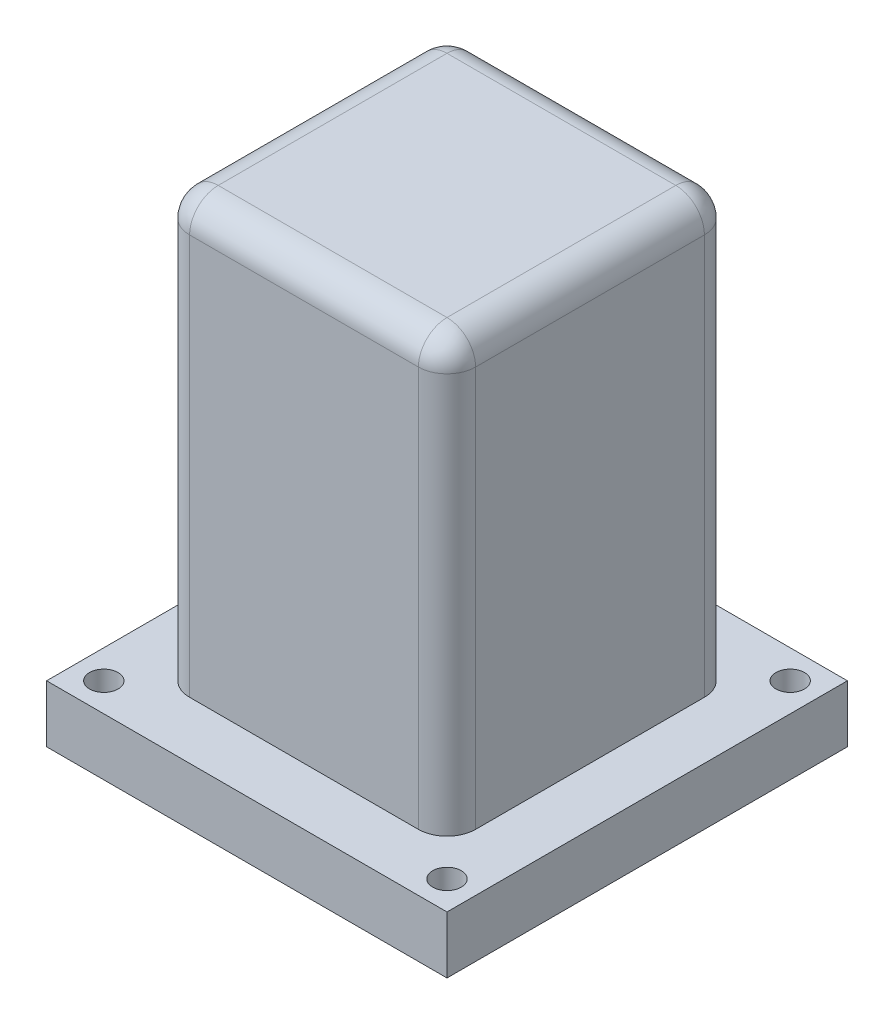
ISO-10303-21;
HEADER;
FILE_DESCRIPTION(('STEP AP214'),'2;1');
FILE_NAME('part.step','',(''),(''),'','','');
FILE_SCHEMA(('AUTOMOTIVE_DESIGN { 1 0 10303 214 1 1 1 1 }'));
ENDSEC;
DATA;
#1=APPLICATION_CONTEXT('core data for automotive mechanical design processes');
#2=APPLICATION_PROTOCOL_DEFINITION('international standard','automotive_design',2000,#1);
#3=PRODUCT_CONTEXT('',#1,'mechanical');
#4=PRODUCT('Part','Part','',(#3));
#5=PRODUCT_RELATED_PRODUCT_CATEGORY('part','',(#4));
#6=PRODUCT_DEFINITION_FORMATION('','',#4);
#7=PRODUCT_DEFINITION_CONTEXT('part definition',#1,'design');
#8=PRODUCT_DEFINITION('design','',#6,#7);
#9=PRODUCT_DEFINITION_SHAPE('','',#8);
#10=(LENGTH_UNIT() NAMED_UNIT(*) SI_UNIT(.MILLI.,.METRE.));
#11=(NAMED_UNIT(*) PLANE_ANGLE_UNIT() SI_UNIT($,.RADIAN.));
#12=(NAMED_UNIT(*) SI_UNIT($,.STERADIAN.) SOLID_ANGLE_UNIT());
#13=UNCERTAINTY_MEASURE_WITH_UNIT(LENGTH_MEASURE(1.E-05),#10,'distance_accuracy_value','');
#14=(GEOMETRIC_REPRESENTATION_CONTEXT(3) GLOBAL_UNCERTAINTY_ASSIGNED_CONTEXT((#13)) GLOBAL_UNIT_ASSIGNED_CONTEXT((#10,
#11,#12)) REPRESENTATION_CONTEXT('',''));
#15=CARTESIAN_POINT('',(0.,0.,0.));
#16=DIRECTION('',(0.,0.,1.));
#17=DIRECTION('',(1.,0.,0.));
#18=AXIS2_PLACEMENT_3D('',#15,#16,#17);
#19=CARTESIAN_POINT('',(0.,0.,0.));
#20=DIRECTION('',(0.,1.,0.));
#21=DIRECTION('',(0.,0.,1.));
#22=AXIS2_PLACEMENT_3D('',#19,#20,#21);
#23=PLANE('',#22);
#24=CARTESIAN_POINT('',(-29.9999999999983,0.,-30.));
#25=DIRECTION('',(0.,-1.,0.));
#26=DIRECTION('',(0.,0.,-1.));
#27=AXIS2_PLACEMENT_3D('',#24,#25,#26);
#28=CIRCLE('',#27,2.50000000000089);
#29=CARTESIAN_POINT('',(-29.9999999999983,0.,-32.5000000000009));
#30=VERTEX_POINT('',#29);
#31=EDGE_CURVE('E607',#30,#30,#28,.T.);
#32=ORIENTED_EDGE('',*,*,#31,.F.);
#33=EDGE_LOOP('',(#32));
#34=FACE_BOUND('',#33,.T.);
#35=CARTESIAN_POINT('',(30.0000000000017,0.,-29.9999999999983));
#36=DIRECTION('',(0.,-1.,0.));
#37=DIRECTION('',(0.,0.,-1.));
#38=AXIS2_PLACEMENT_3D('',#35,#36,#37);
#39=CIRCLE('',#38,2.50000000000237);
#40=CARTESIAN_POINT('',(30.0000000000017,0.,-32.5000000000007));
#41=VERTEX_POINT('',#40);
#42=EDGE_CURVE('E609',#41,#41,#39,.T.);
#43=ORIENTED_EDGE('',*,*,#42,.F.);
#44=EDGE_LOOP('',(#43));
#45=FACE_BOUND('',#44,.T.);
#46=CARTESIAN_POINT('',(30.,0.,30.0000000000017));
#47=DIRECTION('',(0.,-1.,0.));
#48=DIRECTION('',(0.,0.,-1.));
#49=AXIS2_PLACEMENT_3D('',#46,#47,#48);
#50=CIRCLE('',#49,2.50000000000175);
#51=CARTESIAN_POINT('',(30.,0.,27.4999999999999));
#52=VERTEX_POINT('',#51);
#53=EDGE_CURVE('E615',#52,#52,#50,.T.);
#54=ORIENTED_EDGE('',*,*,#53,.F.);
#55=EDGE_LOOP('',(#54));
#56=FACE_BOUND('',#55,.T.);
#57=CARTESIAN_POINT('',(-30.,0.,30.));
#58=DIRECTION('',(0.,-1.,0.));
#59=DIRECTION('',(0.,0.,-1.));
#60=AXIS2_PLACEMENT_3D('',#57,#58,#59);
#61=CIRCLE('',#60,2.5);
#62=CARTESIAN_POINT('',(-30.,0.,27.5));
#63=VERTEX_POINT('',#62);
#64=EDGE_CURVE('E170',#63,#63,#61,.T.);
#65=ORIENTED_EDGE('',*,*,#64,.F.);
#66=EDGE_LOOP('',(#65));
#67=FACE_BOUND('',#66,.T.);
#68=CARTESIAN_POINT('',(0.,0.,0.));
#69=DIRECTION('',(0.,1.,0.));
#70=DIRECTION('',(0.,0.,1.));
#71=AXIS2_PLACEMENT_3D('',#68,#69,#70);
#72=CIRCLE('',#71,5.);
#73=CARTESIAN_POINT('',(0.,0.,5.));
#74=VERTEX_POINT('',#73);
#75=EDGE_CURVE('E200',#74,#74,#72,.F.);
#76=ORIENTED_EDGE('',*,*,#75,.F.);
#77=EDGE_LOOP('',(#76));
#78=FACE_BOUND('',#77,.T.);
#79=DIRECTION('',(0.,0.,1.));
#80=VECTOR('',#79,1.);
#81=CARTESIAN_POINT('',(35.,0.,35.));
#82=LINE('',#81,#80);
#83=CARTESIAN_POINT('',(35.,0.,-35.));
#84=VERTEX_POINT('',#83);
#85=CARTESIAN_POINT('',(35.,0.,35.));
#86=VERTEX_POINT('',#85);
#87=EDGE_CURVE('E175',#84,#86,#82,.T.);
#88=ORIENTED_EDGE('',*,*,#87,.T.);
#89=DIRECTION('',(-1.,0.,0.));
#90=VECTOR('',#89,1.);
#91=CARTESIAN_POINT('',(-35.,0.,35.));
#92=LINE('',#91,#90);
#93=CARTESIAN_POINT('',(-35.,0.,35.));
#94=VERTEX_POINT('',#93);
#95=EDGE_CURVE('E144',#86,#94,#92,.T.);
#96=ORIENTED_EDGE('',*,*,#95,.T.);
#97=DIRECTION('',(0.,0.,-1.));
#98=VECTOR('',#97,1.);
#99=CARTESIAN_POINT('',(-35.,0.,35.));
#100=LINE('',#99,#98);
#101=CARTESIAN_POINT('',(-35.,0.,-35.));
#102=VERTEX_POINT('',#101);
#103=EDGE_CURVE('E167',#94,#102,#100,.T.);
#104=ORIENTED_EDGE('',*,*,#103,.T.);
#105=DIRECTION('',(1.,0.,0.));
#106=VECTOR('',#105,1.);
#107=CARTESIAN_POINT('',(-35.,0.,-35.));
#108=LINE('',#107,#106);
#109=EDGE_CURVE('E164',#102,#84,#108,.T.);
#110=ORIENTED_EDGE('',*,*,#109,.T.);
#111=EDGE_LOOP('',(#88,#96,#104,#110));
#112=FACE_BOUND('',#111,.T.);
#113=ADVANCED_FACE('F37',(#34,#45,#56,#67,#78,#112),#23,.F.);
#114=CARTESIAN_POINT('',(0.,-30.,0.));
#115=DIRECTION('',(0.,1.,0.));
#116=DIRECTION('',(0.,0.,1.));
#117=AXIS2_PLACEMENT_3D('',#114,#115,#116);
#118=CYLINDRICAL_SURFACE('',#117,5.);
#119=CARTESIAN_POINT('',(0.,-30.,0.));
#120=DIRECTION('',(0.,-1.,0.));
#121=DIRECTION('',(0.,0.,-1.));
#122=AXIS2_PLACEMENT_3D('',#119,#120,#121);
#123=CIRCLE('',#122,5.);
#124=CARTESIAN_POINT('',(0.,-30.,-5.));
#125=VERTEX_POINT('',#124);
#126=EDGE_CURVE('E197',#125,#125,#123,.T.);
#127=ORIENTED_EDGE('',*,*,#126,.F.);
#128=EDGE_LOOP('',(#127));
#129=FACE_BOUND('',#128,.T.);
#130=ORIENTED_EDGE('',*,*,#75,.T.);
#131=EDGE_LOOP('',(#130));
#132=FACE_BOUND('',#131,.T.);
#133=ADVANCED_FACE('F343',(#129,#132),#118,.T.);
#134=CARTESIAN_POINT('',(0.,-30.,0.));
#135=DIRECTION('',(0.,-1.,0.));
#136=DIRECTION('',(0.,0.,-1.));
#137=AXIS2_PLACEMENT_3D('',#134,#135,#136);
#138=PLANE('',#137);
#139=ORIENTED_EDGE('',*,*,#126,.T.);
#140=EDGE_LOOP('',(#139));
#141=FACE_BOUND('',#140,.T.);
#142=ADVANCED_FACE('F349',(#141),#138,.T.);
#143=CARTESIAN_POINT('',(0.,10.,0.));
#144=DIRECTION('',(0.,-1.,0.));
#145=DIRECTION('',(0.,0.,-1.));
#146=AXIS2_PLACEMENT_3D('',#143,#144,#145);
#147=PLANE('',#146);
#148=CARTESIAN_POINT('',(-29.9999999999983,10.,-30.));
#149=DIRECTION('',(0.,-1.,0.));
#150=DIRECTION('',(0.,0.,-1.));
#151=AXIS2_PLACEMENT_3D('',#148,#149,#150);
#152=CIRCLE('',#151,2.50000000000089);
#153=CARTESIAN_POINT('',(-29.9999999999983,10.,-32.5000000000009));
#154=VERTEX_POINT('',#153);
#155=EDGE_CURVE('E605',#154,#154,#152,.T.);
#156=ORIENTED_EDGE('',*,*,#155,.T.);
#157=EDGE_LOOP('',(#156));
#158=FACE_BOUND('',#157,.T.);
#159=CARTESIAN_POINT('',(30.0000000000017,10.,-29.9999999999983));
#160=DIRECTION('',(0.,-1.,0.));
#161=DIRECTION('',(0.,0.,-1.));
#162=AXIS2_PLACEMENT_3D('',#159,#160,#161);
#163=CIRCLE('',#162,2.50000000000237);
#164=CARTESIAN_POINT('',(30.0000000000017,10.,-32.5000000000007));
#165=VERTEX_POINT('',#164);
#166=EDGE_CURVE('E612',#165,#165,#163,.T.);
#167=ORIENTED_EDGE('',*,*,#166,.T.);
#168=EDGE_LOOP('',(#167));
#169=FACE_BOUND('',#168,.T.);
#170=CARTESIAN_POINT('',(30.,10.,30.0000000000017));
#171=DIRECTION('',(0.,-1.,0.));
#172=DIRECTION('',(0.,0.,-1.));
#173=AXIS2_PLACEMENT_3D('',#170,#171,#172);
#174=CIRCLE('',#173,2.50000000000175);
#175=CARTESIAN_POINT('',(30.,10.,27.4999999999999));
#176=VERTEX_POINT('',#175);
#177=EDGE_CURVE('E618',#176,#176,#174,.T.);
#178=ORIENTED_EDGE('',*,*,#177,.T.);
#179=EDGE_LOOP('',(#178));
#180=FACE_BOUND('',#179,.T.);
#181=CARTESIAN_POINT('',(-30.,10.,30.));
#182=DIRECTION('',(0.,-1.,0.));
#183=DIRECTION('',(0.,0.,-1.));
#184=AXIS2_PLACEMENT_3D('',#181,#182,#183);
#185=CIRCLE('',#184,2.5);
#186=CARTESIAN_POINT('',(-30.,10.,27.5));
#187=VERTEX_POINT('',#186);
#188=EDGE_CURVE('E268',#187,#187,#185,.T.);
#189=ORIENTED_EDGE('',*,*,#188,.T.);
#190=EDGE_LOOP('',(#189));
#191=FACE_BOUND('',#190,.T.);
#192=DIRECTION('',(0.,0.,1.));
#193=VECTOR('',#192,1.);
#194=CARTESIAN_POINT('',(35.,10.,35.));
#195=LINE('',#194,#193);
#196=CARTESIAN_POINT('',(35.,10.,-35.));
#197=VERTEX_POINT('',#196);
#198=CARTESIAN_POINT('',(35.,10.,35.));
#199=VERTEX_POINT('',#198);
#200=EDGE_CURVE('E157',#197,#199,#195,.T.);
#201=ORIENTED_EDGE('',*,*,#200,.F.);
#202=DIRECTION('',(1.,0.,0.));
#203=VECTOR('',#202,1.);
#204=CARTESIAN_POINT('',(-35.,10.,-35.));
#205=LINE('',#204,#203);
#206=CARTESIAN_POINT('',(-35.,10.,-35.));
#207=VERTEX_POINT('',#206);
#208=EDGE_CURVE('E150',#207,#197,#205,.T.);
#209=ORIENTED_EDGE('',*,*,#208,.F.);
#210=DIRECTION('',(0.,0.,-1.));
#211=VECTOR('',#210,1.);
#212=CARTESIAN_POINT('',(-35.,10.,35.));
#213=LINE('',#212,#211);
#214=CARTESIAN_POINT('',(-35.,10.,35.));
#215=VERTEX_POINT('',#214);
#216=EDGE_CURVE('E160',#215,#207,#213,.T.);
#217=ORIENTED_EDGE('',*,*,#216,.F.);
#218=DIRECTION('',(-1.,0.,0.));
#219=VECTOR('',#218,1.);
#220=CARTESIAN_POINT('',(-35.,10.,35.));
#221=LINE('',#220,#219);
#222=EDGE_CURVE('E142',#199,#215,#221,.T.);
#223=ORIENTED_EDGE('',*,*,#222,.F.);
#224=EDGE_LOOP('',(#201,#209,#217,#223));
#225=FACE_BOUND('',#224,.T.);
#226=DIRECTION('',(0.,0.,-1.));
#227=VECTOR('',#226,1.);
#228=CARTESIAN_POINT('',(-25.,9.99999999999999,-25.));
#229=LINE('',#228,#227);
#230=CARTESIAN_POINT('',(-25.,9.99999999999999,20.));
#231=VERTEX_POINT('',#230);
#232=CARTESIAN_POINT('',(-25.,9.99999999999999,-20.));
#233=VERTEX_POINT('',#232);
#234=EDGE_CURVE('E191',#231,#233,#229,.T.);
#235=ORIENTED_EDGE('',*,*,#234,.T.);
#236=CARTESIAN_POINT('',(-20.,9.99999999999999,-20.));
#237=DIRECTION('',(0.,-1.,0.));
#238=DIRECTION('',(0.,0.,-1.));
#239=AXIS2_PLACEMENT_3D('',#236,#237,#238);
#240=CIRCLE('',#239,5.);
#241=CARTESIAN_POINT('',(-20.,9.99999999999999,-25.));
#242=VERTEX_POINT('',#241);
#243=EDGE_CURVE('E46',#233,#242,#240,.T.);
#244=ORIENTED_EDGE('',*,*,#243,.T.);
#245=DIRECTION('',(1.,0.,0.));
#246=VECTOR('',#245,1.);
#247=CARTESIAN_POINT('',(-25.,9.99999999999999,-25.));
#248=LINE('',#247,#246);
#249=CARTESIAN_POINT('',(20.,9.99999999999999,-25.));
#250=VERTEX_POINT('',#249);
#251=EDGE_CURVE('E194',#242,#250,#248,.T.);
#252=ORIENTED_EDGE('',*,*,#251,.T.);
#253=CARTESIAN_POINT('',(20.,9.99999999999999,-20.));
#254=DIRECTION('',(0.,-1.,0.));
#255=DIRECTION('',(0.,0.,-1.));
#256=AXIS2_PLACEMENT_3D('',#253,#254,#255);
#257=CIRCLE('',#256,5.);
#258=CARTESIAN_POINT('',(25.,9.99999999999999,-20.));
#259=VERTEX_POINT('',#258);
#260=EDGE_CURVE('E11',#250,#259,#257,.T.);
#261=ORIENTED_EDGE('',*,*,#260,.T.);
#262=DIRECTION('',(0.,0.,1.));
#263=VECTOR('',#262,1.);
#264=CARTESIAN_POINT('',(25.,9.99999999999999,-25.));
#265=LINE('',#264,#263);
#266=CARTESIAN_POINT('',(25.,9.99999999999999,20.));
#267=VERTEX_POINT('',#266);
#268=EDGE_CURVE('E186',#259,#267,#265,.T.);
#269=ORIENTED_EDGE('',*,*,#268,.T.);
#270=CARTESIAN_POINT('',(20.,9.99999999999999,20.));
#271=DIRECTION('',(0.,-1.,0.));
#272=DIRECTION('',(0.,0.,-1.));
#273=AXIS2_PLACEMENT_3D('',#270,#271,#272);
#274=CIRCLE('',#273,5.);
#275=CARTESIAN_POINT('',(20.,9.99999999999999,25.));
#276=VERTEX_POINT('',#275);
#277=EDGE_CURVE('E240',#276,#267,#274,.F.);
#278=ORIENTED_EDGE('',*,*,#277,.F.);
#279=DIRECTION('',(-1.,0.,0.));
#280=VECTOR('',#279,1.);
#281=CARTESIAN_POINT('',(-25.,9.99999999999999,25.));
#282=LINE('',#281,#280);
#283=CARTESIAN_POINT('',(-20.,9.99999999999999,25.));
#284=VERTEX_POINT('',#283);
#285=EDGE_CURVE('E181',#276,#284,#282,.T.);
#286=ORIENTED_EDGE('',*,*,#285,.T.);
#287=CARTESIAN_POINT('',(-20.,9.99999999999999,20.));
#288=DIRECTION('',(0.,-1.,0.));
#289=DIRECTION('',(0.,0.,-1.));
#290=AXIS2_PLACEMENT_3D('',#287,#288,#289);
#291=CIRCLE('',#290,5.);
#292=EDGE_CURVE('E188',#231,#284,#291,.F.);
#293=ORIENTED_EDGE('',*,*,#292,.F.);
#294=EDGE_LOOP('',(#235,#244,#252,#261,#269,#278,#286,#293));
#295=FACE_BOUND('',#294,.T.);
#296=ADVANCED_FACE('F155',(#158,#169,#180,#191,#225,#295),#147,.F.);
#297=CARTESIAN_POINT('',(35.,10.,35.));
#298=DIRECTION('',(1.,0.,0.));
#299=DIRECTION('',(0.,0.,-1.));
#300=AXIS2_PLACEMENT_3D('',#297,#298,#299);
#301=PLANE('',#300);
#302=ORIENTED_EDGE('',*,*,#87,.F.);
#303=DIRECTION('',(0.,-1.,0.));
#304=VECTOR('',#303,1.);
#305=CARTESIAN_POINT('',(35.,10.,-35.));
#306=LINE('',#305,#304);
#307=EDGE_CURVE('E163',#197,#84,#306,.T.);
#308=ORIENTED_EDGE('',*,*,#307,.F.);
#309=ORIENTED_EDGE('',*,*,#200,.T.);
#310=DIRECTION('',(0.,-1.,0.));
#311=VECTOR('',#310,1.);
#312=CARTESIAN_POINT('',(35.,10.,35.));
#313=LINE('',#312,#311);
#314=EDGE_CURVE('E139',#199,#86,#313,.T.);
#315=ORIENTED_EDGE('',*,*,#314,.T.);
#316=EDGE_LOOP('',(#302,#308,#309,#315));
#317=FACE_BOUND('',#316,.T.);
#318=ADVANCED_FACE('F162',(#317),#301,.T.);
#319=CARTESIAN_POINT('',(-35.,10.,-35.));
#320=DIRECTION('',(0.,0.,-1.));
#321=DIRECTION('',(-1.,0.,0.));
#322=AXIS2_PLACEMENT_3D('',#319,#320,#321);
#323=PLANE('',#322);
#324=ORIENTED_EDGE('',*,*,#109,.F.);
#325=DIRECTION('',(0.,-1.,0.));
#326=VECTOR('',#325,1.);
#327=CARTESIAN_POINT('',(-35.,10.,-35.));
#328=LINE('',#327,#326);
#329=EDGE_CURVE('E182',#207,#102,#328,.T.);
#330=ORIENTED_EDGE('',*,*,#329,.F.);
#331=ORIENTED_EDGE('',*,*,#208,.T.);
#332=ORIENTED_EDGE('',*,*,#307,.T.);
#333=EDGE_LOOP('',(#324,#330,#331,#332));
#334=FACE_BOUND('',#333,.T.);
#335=ADVANCED_FACE('F477',(#334),#323,.T.);
#336=CARTESIAN_POINT('',(-35.,10.,35.));
#337=DIRECTION('',(-1.,0.,0.));
#338=DIRECTION('',(0.,0.,1.));
#339=AXIS2_PLACEMENT_3D('',#336,#337,#338);
#340=PLANE('',#339);
#341=ORIENTED_EDGE('',*,*,#103,.F.);
#342=DIRECTION('',(0.,-1.,0.));
#343=VECTOR('',#342,1.);
#344=CARTESIAN_POINT('',(-35.,10.,35.));
#345=LINE('',#344,#343);
#346=EDGE_CURVE('E149',#215,#94,#345,.T.);
#347=ORIENTED_EDGE('',*,*,#346,.F.);
#348=ORIENTED_EDGE('',*,*,#216,.T.);
#349=ORIENTED_EDGE('',*,*,#329,.T.);
#350=EDGE_LOOP('',(#341,#347,#348,#349));
#351=FACE_BOUND('',#350,.T.);
#352=ADVANCED_FACE('F480',(#351),#340,.T.);
#353=CARTESIAN_POINT('',(-35.,10.,35.));
#354=DIRECTION('',(0.,0.,1.));
#355=DIRECTION('',(1.,0.,0.));
#356=AXIS2_PLACEMENT_3D('',#353,#354,#355);
#357=PLANE('',#356);
#358=ORIENTED_EDGE('',*,*,#95,.F.);
#359=ORIENTED_EDGE('',*,*,#314,.F.);
#360=ORIENTED_EDGE('',*,*,#222,.T.);
#361=ORIENTED_EDGE('',*,*,#346,.T.);
#362=EDGE_LOOP('',(#358,#359,#360,#361));
#363=FACE_BOUND('',#362,.T.);
#364=ADVANCED_FACE('F141',(#363),#357,.T.);
#365=CARTESIAN_POINT('',(20.,80.,0.));
#366=DIRECTION('',(0.,0.,1.));
#367=DIRECTION('',(1.,0.,0.));
#368=AXIS2_PLACEMENT_3D('',#365,#366,#367);
#369=CYLINDRICAL_SURFACE('',#368,5.);
#370=DIRECTION('',(0.,0.,-1.));
#371=VECTOR('',#370,1.);
#372=CARTESIAN_POINT('',(25.,80.,20.));
#373=LINE('',#372,#371);
#374=CARTESIAN_POINT('',(25.,80.,-20.));
#375=VERTEX_POINT('',#374);
#376=CARTESIAN_POINT('',(25.,80.,20.));
#377=VERTEX_POINT('',#376);
#378=EDGE_CURVE('E238',#375,#377,#373,.F.);
#379=ORIENTED_EDGE('',*,*,#378,.F.);
#380=CARTESIAN_POINT('',(20.,80.,-20.));
#381=DIRECTION('',(0.,0.,1.));
#382=DIRECTION('',(1.,0.,0.));
#383=AXIS2_PLACEMENT_3D('',#380,#381,#382);
#384=CIRCLE('',#383,5.);
#385=CARTESIAN_POINT('',(20.,85.,-20.));
#386=VERTEX_POINT('',#385);
#387=EDGE_CURVE('E260',#375,#386,#384,.T.);
#388=ORIENTED_EDGE('',*,*,#387,.T.);
#389=DIRECTION('',(0.,0.,-1.));
#390=VECTOR('',#389,1.);
#391=CARTESIAN_POINT('',(20.,85.,-25.));
#392=LINE('',#391,#390);
#393=CARTESIAN_POINT('',(20.,85.,20.));
#394=VERTEX_POINT('',#393);
#395=EDGE_CURVE('E230',#394,#386,#392,.T.);
#396=ORIENTED_EDGE('',*,*,#395,.F.);
#397=CARTESIAN_POINT('',(20.,80.,20.));
#398=DIRECTION('',(0.,0.,1.));
#399=DIRECTION('',(0.,-1.,0.));
#400=AXIS2_PLACEMENT_3D('',#397,#398,#399);
#401=CIRCLE('',#400,5.);
#402=EDGE_CURVE('E196',#377,#394,#401,.T.);
#403=ORIENTED_EDGE('',*,*,#402,.F.);
#404=EDGE_LOOP('',(#379,#388,#396,#403));
#405=FACE_BOUND('',#404,.T.);
#406=ADVANCED_FACE('F332',(#405),#369,.T.);
#407=CARTESIAN_POINT('',(0.,85.,0.));
#408=DIRECTION('',(0.,1.,0.));
#409=DIRECTION('',(0.,0.,1.));
#410=AXIS2_PLACEMENT_3D('',#407,#408,#409);
#411=PLANE('',#410);
#412=ORIENTED_EDGE('',*,*,#395,.T.);
#413=DIRECTION('',(-1.,0.,0.));
#414=VECTOR('',#413,1.);
#415=CARTESIAN_POINT('',(-20.,85.,-20.));
#416=LINE('',#415,#414);
#417=CARTESIAN_POINT('',(-20.,85.,-20.));
#418=VERTEX_POINT('',#417);
#419=EDGE_CURVE('E258',#386,#418,#416,.T.);
#420=ORIENTED_EDGE('',*,*,#419,.T.);
#421=DIRECTION('',(0.,0.,1.));
#422=VECTOR('',#421,1.);
#423=CARTESIAN_POINT('',(-20.,85.,20.));
#424=LINE('',#423,#422);
#425=CARTESIAN_POINT('',(-20.,85.,20.));
#426=VERTEX_POINT('',#425);
#427=EDGE_CURVE('E233',#418,#426,#424,.T.);
#428=ORIENTED_EDGE('',*,*,#427,.T.);
#429=DIRECTION('',(1.,0.,0.));
#430=VECTOR('',#429,1.);
#431=CARTESIAN_POINT('',(25.,85.,20.));
#432=LINE('',#431,#430);
#433=EDGE_CURVE('E212',#426,#394,#432,.T.);
#434=ORIENTED_EDGE('',*,*,#433,.T.);
#435=EDGE_LOOP('',(#412,#420,#428,#434));
#436=FACE_BOUND('',#435,.T.);
#437=ADVANCED_FACE('F305',(#436),#411,.T.);
#438=CARTESIAN_POINT('',(-20.,80.,0.));
#439=DIRECTION('',(0.,0.,-1.));
#440=DIRECTION('',(-1.,0.,0.));
#441=AXIS2_PLACEMENT_3D('',#438,#439,#440);
#442=CYLINDRICAL_SURFACE('',#441,5.);
#443=ORIENTED_EDGE('',*,*,#427,.F.);
#444=CARTESIAN_POINT('',(-20.,80.,-20.));
#445=DIRECTION('',(0.,0.,-1.));
#446=DIRECTION('',(-1.,0.,0.));
#447=AXIS2_PLACEMENT_3D('',#444,#445,#446);
#448=CIRCLE('',#447,5.);
#449=CARTESIAN_POINT('',(-25.,80.,-20.));
#450=VERTEX_POINT('',#449);
#451=EDGE_CURVE('E256',#418,#450,#448,.F.);
#452=ORIENTED_EDGE('',*,*,#451,.T.);
#453=DIRECTION('',(0.,0.,1.));
#454=VECTOR('',#453,1.);
#455=CARTESIAN_POINT('',(-25.,80.,-25.));
#456=LINE('',#455,#454);
#457=CARTESIAN_POINT('',(-25.,80.,20.));
#458=VERTEX_POINT('',#457);
#459=EDGE_CURVE('E235',#458,#450,#456,.F.);
#460=ORIENTED_EDGE('',*,*,#459,.F.);
#461=CARTESIAN_POINT('',(-20.,80.,20.));
#462=DIRECTION('',(0.,0.,1.));
#463=DIRECTION('',(1.,0.,0.));
#464=AXIS2_PLACEMENT_3D('',#461,#462,#463);
#465=CIRCLE('',#464,5.);
#466=EDGE_CURVE('E201',#426,#458,#465,.T.);
#467=ORIENTED_EDGE('',*,*,#466,.F.);
#468=EDGE_LOOP('',(#443,#452,#460,#467));
#469=FACE_BOUND('',#468,.T.);
#470=ADVANCED_FACE('F308',(#469),#442,.T.);
#471=CARTESIAN_POINT('',(0.,80.,20.));
#472=DIRECTION('',(-1.,0.,0.));
#473=DIRECTION('',(0.,0.,1.));
#474=AXIS2_PLACEMENT_3D('',#471,#472,#473);
#475=CYLINDRICAL_SURFACE('',#474,5.);
#476=ORIENTED_EDGE('',*,*,#433,.F.);
#477=CARTESIAN_POINT('',(-20.,80.,20.));
#478=DIRECTION('',(-1.,0.,0.));
#479=DIRECTION('',(0.,0.,1.));
#480=AXIS2_PLACEMENT_3D('',#477,#478,#479);
#481=CIRCLE('',#480,5.);
#482=CARTESIAN_POINT('',(-20.,80.,25.));
#483=VERTEX_POINT('',#482);
#484=EDGE_CURVE('E225',#426,#483,#481,.F.);
#485=ORIENTED_EDGE('',*,*,#484,.T.);
#486=DIRECTION('',(1.,0.,0.));
#487=VECTOR('',#486,1.);
#488=CARTESIAN_POINT('',(-25.,80.,25.));
#489=LINE('',#488,#487);
#490=CARTESIAN_POINT('',(20.,80.,25.));
#491=VERTEX_POINT('',#490);
#492=EDGE_CURVE('E207',#491,#483,#489,.F.);
#493=ORIENTED_EDGE('',*,*,#492,.F.);
#494=CARTESIAN_POINT('',(20.,80.,20.));
#495=DIRECTION('',(-1.,0.,0.));
#496=DIRECTION('',(0.,0.,1.));
#497=AXIS2_PLACEMENT_3D('',#494,#495,#496);
#498=CIRCLE('',#497,5.);
#499=EDGE_CURVE('E223',#491,#394,#498,.T.);
#500=ORIENTED_EDGE('',*,*,#499,.T.);
#501=EDGE_LOOP('',(#476,#485,#493,#500));
#502=FACE_BOUND('',#501,.T.);
#503=ADVANCED_FACE('F315',(#502),#475,.T.);
#504=CARTESIAN_POINT('',(-20.,80.,20.));
#505=DIRECTION('',(0.,0.,1.));
#506=DIRECTION('',(1.,0.,0.));
#507=AXIS2_PLACEMENT_3D('',#504,#505,#506);
#508=SPHERICAL_SURFACE('',#507,5.);
#509=CARTESIAN_POINT('',(-20.,80.,20.));
#510=DIRECTION('',(0.,-1.,0.));
#511=DIRECTION('',(0.,0.,-1.));
#512=AXIS2_PLACEMENT_3D('',#509,#510,#511);
#513=CIRCLE('',#512,5.);
#514=EDGE_CURVE('E220',#483,#458,#513,.T.);
#515=ORIENTED_EDGE('',*,*,#514,.F.);
#516=ORIENTED_EDGE('',*,*,#484,.F.);
#517=ORIENTED_EDGE('',*,*,#466,.T.);
#518=EDGE_LOOP('',(#515,#516,#517));
#519=FACE_BOUND('',#518,.T.);
#520=ADVANCED_FACE('F312',(#519),#508,.T.);
#521=CARTESIAN_POINT('',(20.,80.,20.));
#522=DIRECTION('',(0.,0.,1.));
#523=DIRECTION('',(1.,0.,0.));
#524=AXIS2_PLACEMENT_3D('',#521,#522,#523);
#525=SPHERICAL_SURFACE('',#524,5.);
#526=ORIENTED_EDGE('',*,*,#402,.T.);
#527=ORIENTED_EDGE('',*,*,#499,.F.);
#528=CARTESIAN_POINT('',(20.,80.,20.));
#529=DIRECTION('',(0.,-1.,0.));
#530=DIRECTION('',(0.,0.,-1.));
#531=AXIS2_PLACEMENT_3D('',#528,#529,#530);
#532=CIRCLE('',#531,5.);
#533=EDGE_CURVE('E227',#377,#491,#532,.T.);
#534=ORIENTED_EDGE('',*,*,#533,.F.);
#535=EDGE_LOOP('',(#526,#527,#534));
#536=FACE_BOUND('',#535,.T.);
#537=ADVANCED_FACE('F330',(#536),#525,.T.);
#538=CARTESIAN_POINT('',(-20.,85.,20.));
#539=DIRECTION('',(0.,-1.,0.));
#540=DIRECTION('',(0.,0.,-1.));
#541=AXIS2_PLACEMENT_3D('',#538,#539,#540);
#542=CYLINDRICAL_SURFACE('',#541,5.);
#543=DIRECTION('',(0.,-1.,0.));
#544=VECTOR('',#543,1.);
#545=CARTESIAN_POINT('',(-25.,85.,20.));
#546=LINE('',#545,#544);
#547=EDGE_CURVE('E218',#231,#458,#546,.F.);
#548=ORIENTED_EDGE('',*,*,#547,.F.);
#549=ORIENTED_EDGE('',*,*,#292,.T.);
#550=DIRECTION('',(0.,-1.,0.));
#551=VECTOR('',#550,1.);
#552=CARTESIAN_POINT('',(-20.,85.,25.));
#553=LINE('',#552,#551);
#554=EDGE_CURVE('E204',#483,#284,#553,.T.);
#555=ORIENTED_EDGE('',*,*,#554,.F.);
#556=ORIENTED_EDGE('',*,*,#514,.T.);
#557=EDGE_LOOP('',(#548,#549,#555,#556));
#558=FACE_BOUND('',#557,.T.);
#559=ADVANCED_FACE('F323',(#558),#542,.T.);
#560=CARTESIAN_POINT('',(20.,85.,20.));
#561=DIRECTION('',(0.,-1.,0.));
#562=DIRECTION('',(0.,0.,-1.));
#563=AXIS2_PLACEMENT_3D('',#560,#561,#562);
#564=CYLINDRICAL_SURFACE('',#563,5.);
#565=DIRECTION('',(0.,-1.,0.));
#566=VECTOR('',#565,1.);
#567=CARTESIAN_POINT('',(20.,85.,25.));
#568=LINE('',#567,#566);
#569=EDGE_CURVE('E210',#276,#491,#568,.F.);
#570=ORIENTED_EDGE('',*,*,#569,.F.);
#571=ORIENTED_EDGE('',*,*,#277,.T.);
#572=DIRECTION('',(0.,-1.,0.));
#573=VECTOR('',#572,1.);
#574=CARTESIAN_POINT('',(25.,85.,20.));
#575=LINE('',#574,#573);
#576=EDGE_CURVE('E215',#377,#267,#575,.T.);
#577=ORIENTED_EDGE('',*,*,#576,.F.);
#578=ORIENTED_EDGE('',*,*,#533,.T.);
#579=EDGE_LOOP('',(#570,#571,#577,#578));
#580=FACE_BOUND('',#579,.T.);
#581=ADVANCED_FACE('F325',(#580),#564,.T.);
#582=CARTESIAN_POINT('',(-25.,85.,25.));
#583=DIRECTION('',(0.,0.,-1.));
#584=DIRECTION('',(-1.,0.,0.));
#585=AXIS2_PLACEMENT_3D('',#582,#583,#584);
#586=PLANE('',#585);
#587=ORIENTED_EDGE('',*,*,#285,.F.);
#588=ORIENTED_EDGE('',*,*,#569,.T.);
#589=ORIENTED_EDGE('',*,*,#492,.T.);
#590=ORIENTED_EDGE('',*,*,#554,.T.);
#591=EDGE_LOOP('',(#587,#588,#589,#590));
#592=FACE_BOUND('',#591,.T.);
#593=ADVANCED_FACE('F319',(#592),#586,.F.);
#594=CARTESIAN_POINT('',(-25.,85.,-25.));
#595=DIRECTION('',(1.,0.,0.));
#596=DIRECTION('',(0.,0.,-1.));
#597=AXIS2_PLACEMENT_3D('',#594,#595,#596);
#598=PLANE('',#597);
#599=ORIENTED_EDGE('',*,*,#459,.T.);
#600=DIRECTION('',(0.,-1.,0.));
#601=VECTOR('',#600,1.);
#602=CARTESIAN_POINT('',(-25.,85.,-20.));
#603=LINE('',#602,#601);
#604=EDGE_CURVE('E247',#450,#233,#603,.T.);
#605=ORIENTED_EDGE('',*,*,#604,.T.);
#606=ORIENTED_EDGE('',*,*,#234,.F.);
#607=ORIENTED_EDGE('',*,*,#547,.T.);
#608=EDGE_LOOP('',(#599,#605,#606,#607));
#609=FACE_BOUND('',#608,.T.);
#610=ADVANCED_FACE('F292',(#609),#598,.F.);
#611=CARTESIAN_POINT('',(-25.,85.,-25.));
#612=DIRECTION('',(0.,0.,1.));
#613=DIRECTION('',(1.,0.,0.));
#614=AXIS2_PLACEMENT_3D('',#611,#612,#613);
#615=PLANE('',#614);
#616=ORIENTED_EDGE('',*,*,#251,.F.);
#617=DIRECTION('',(0.,-1.,0.));
#618=VECTOR('',#617,1.);
#619=CARTESIAN_POINT('',(-20.,85.,-25.));
#620=LINE('',#619,#618);
#621=CARTESIAN_POINT('',(-20.,80.,-25.));
#622=VERTEX_POINT('',#621);
#623=EDGE_CURVE('E254',#242,#622,#620,.F.);
#624=ORIENTED_EDGE('',*,*,#623,.T.);
#625=DIRECTION('',(-1.,0.,0.));
#626=VECTOR('',#625,1.);
#627=CARTESIAN_POINT('',(20.,80.,-25.));
#628=LINE('',#627,#626);
#629=CARTESIAN_POINT('',(20.,80.,-25.));
#630=VERTEX_POINT('',#629);
#631=EDGE_CURVE('E252',#622,#630,#628,.F.);
#632=ORIENTED_EDGE('',*,*,#631,.T.);
#633=DIRECTION('',(0.,-1.,0.));
#634=VECTOR('',#633,1.);
#635=CARTESIAN_POINT('',(20.,85.,-25.));
#636=LINE('',#635,#634);
#637=EDGE_CURVE('E250',#630,#250,#636,.T.);
#638=ORIENTED_EDGE('',*,*,#637,.T.);
#639=EDGE_LOOP('',(#616,#624,#632,#638));
#640=FACE_BOUND('',#639,.T.);
#641=ADVANCED_FACE('F285',(#640),#615,.F.);
#642=CARTESIAN_POINT('',(25.,85.,-25.));
#643=DIRECTION('',(-1.,0.,0.));
#644=DIRECTION('',(0.,0.,1.));
#645=AXIS2_PLACEMENT_3D('',#642,#643,#644);
#646=PLANE('',#645);
#647=ORIENTED_EDGE('',*,*,#268,.F.);
#648=DIRECTION('',(0.,-1.,0.));
#649=VECTOR('',#648,1.);
#650=CARTESIAN_POINT('',(25.,85.,-20.));
#651=LINE('',#650,#649);
#652=EDGE_CURVE('E59',#259,#375,#651,.F.);
#653=ORIENTED_EDGE('',*,*,#652,.T.);
#654=ORIENTED_EDGE('',*,*,#378,.T.);
#655=ORIENTED_EDGE('',*,*,#576,.T.);
#656=EDGE_LOOP('',(#647,#653,#654,#655));
#657=FACE_BOUND('',#656,.T.);
#658=ADVANCED_FACE('F333',(#657),#646,.F.);
#659=CARTESIAN_POINT('',(20.,85.,-20.));
#660=DIRECTION('',(0.,-1.,0.));
#661=DIRECTION('',(0.,0.,-1.));
#662=AXIS2_PLACEMENT_3D('',#659,#660,#661);
#663=CYLINDRICAL_SURFACE('',#662,5.);
#664=CARTESIAN_POINT('',(20.,80.,-20.));
#665=DIRECTION('',(0.,1.,0.));
#666=DIRECTION('',(0.,0.,1.));
#667=AXIS2_PLACEMENT_3D('',#664,#665,#666);
#668=CIRCLE('',#667,5.);
#669=EDGE_CURVE('E41',#375,#630,#668,.T.);
#670=ORIENTED_EDGE('',*,*,#669,.F.);
#671=ORIENTED_EDGE('',*,*,#652,.F.);
#672=ORIENTED_EDGE('',*,*,#260,.F.);
#673=ORIENTED_EDGE('',*,*,#637,.F.);
#674=EDGE_LOOP('',(#670,#671,#672,#673));
#675=FACE_BOUND('',#674,.T.);
#676=ADVANCED_FACE('F39',(#675),#663,.T.);
#677=CARTESIAN_POINT('',(20.,80.,-20.));
#678=DIRECTION('',(0.,0.,1.));
#679=DIRECTION('',(1.,0.,0.));
#680=AXIS2_PLACEMENT_3D('',#677,#678,#679);
#681=SPHERICAL_SURFACE('',#680,5.);
#682=ORIENTED_EDGE('',*,*,#387,.F.);
#683=ORIENTED_EDGE('',*,*,#669,.T.);
#684=CARTESIAN_POINT('',(20.,80.,-20.));
#685=DIRECTION('',(-1.,0.,0.));
#686=DIRECTION('',(0.,0.,1.));
#687=AXIS2_PLACEMENT_3D('',#684,#685,#686);
#688=CIRCLE('',#687,5.);
#689=EDGE_CURVE('E270',#386,#630,#688,.T.);
#690=ORIENTED_EDGE('',*,*,#689,.F.);
#691=EDGE_LOOP('',(#682,#683,#690));
#692=FACE_BOUND('',#691,.T.);
#693=ADVANCED_FACE('F280',(#692),#681,.T.);
#694=CARTESIAN_POINT('',(0.,80.,-20.));
#695=DIRECTION('',(1.,0.,0.));
#696=DIRECTION('',(0.,0.,-1.));
#697=AXIS2_PLACEMENT_3D('',#694,#695,#696);
#698=CYLINDRICAL_SURFACE('',#697,5.);
#699=CARTESIAN_POINT('',(-20.,80.,-20.));
#700=DIRECTION('',(-1.,0.,0.));
#701=DIRECTION('',(0.,0.,1.));
#702=AXIS2_PLACEMENT_3D('',#699,#700,#701);
#703=CIRCLE('',#702,5.);
#704=EDGE_CURVE('E267',#418,#622,#703,.T.);
#705=ORIENTED_EDGE('',*,*,#704,.F.);
#706=ORIENTED_EDGE('',*,*,#419,.F.);
#707=ORIENTED_EDGE('',*,*,#689,.T.);
#708=ORIENTED_EDGE('',*,*,#631,.F.);
#709=EDGE_LOOP('',(#705,#706,#707,#708));
#710=FACE_BOUND('',#709,.T.);
#711=ADVANCED_FACE('F302',(#710),#698,.T.);
#712=CARTESIAN_POINT('',(-20.,80.,-20.));
#713=DIRECTION('',(0.,0.,1.));
#714=DIRECTION('',(1.,0.,0.));
#715=AXIS2_PLACEMENT_3D('',#712,#713,#714);
#716=SPHERICAL_SURFACE('',#715,5.);
#717=ORIENTED_EDGE('',*,*,#451,.F.);
#718=ORIENTED_EDGE('',*,*,#704,.T.);
#719=CARTESIAN_POINT('',(-20.,80.,-20.));
#720=DIRECTION('',(0.,-1.,0.));
#721=DIRECTION('',(0.,0.,-1.));
#722=AXIS2_PLACEMENT_3D('',#719,#720,#721);
#723=CIRCLE('',#722,5.);
#724=EDGE_CURVE('E264',#450,#622,#723,.T.);
#725=ORIENTED_EDGE('',*,*,#724,.F.);
#726=EDGE_LOOP('',(#717,#718,#725));
#727=FACE_BOUND('',#726,.T.);
#728=ADVANCED_FACE('F300',(#727),#716,.T.);
#729=CARTESIAN_POINT('',(-20.,85.,-20.));
#730=DIRECTION('',(0.,-1.,0.));
#731=DIRECTION('',(0.,0.,-1.));
#732=AXIS2_PLACEMENT_3D('',#729,#730,#731);
#733=CYLINDRICAL_SURFACE('',#732,5.);
#734=ORIENTED_EDGE('',*,*,#724,.T.);
#735=ORIENTED_EDGE('',*,*,#623,.F.);
#736=ORIENTED_EDGE('',*,*,#243,.F.);
#737=ORIENTED_EDGE('',*,*,#604,.F.);
#738=EDGE_LOOP('',(#734,#735,#736,#737));
#739=FACE_BOUND('',#738,.T.);
#740=ADVANCED_FACE('F290',(#739),#733,.T.);
#741=CARTESIAN_POINT('',(-30.,10.,30.));
#742=DIRECTION('',(0.,-1.,0.));
#743=DIRECTION('',(0.,0.,-1.));
#744=AXIS2_PLACEMENT_3D('',#741,#742,#743);
#745=CYLINDRICAL_SURFACE('',#744,2.5);
#746=ORIENTED_EDGE('',*,*,#188,.F.);
#747=EDGE_LOOP('',(#746));
#748=FACE_BOUND('',#747,.T.);
#749=ORIENTED_EDGE('',*,*,#64,.T.);
#750=EDGE_LOOP('',(#749));
#751=FACE_BOUND('',#750,.T.);
#752=ADVANCED_FACE('F414',(#748,#751),#745,.F.);
#753=CARTESIAN_POINT('',(30.,10.,30.0000000000017));
#754=DIRECTION('',(0.,-1.,0.));
#755=DIRECTION('',(0.,0.,-1.));
#756=AXIS2_PLACEMENT_3D('',#753,#754,#755);
#757=CYLINDRICAL_SURFACE('',#756,2.50000000000175);
#758=ORIENTED_EDGE('',*,*,#177,.F.);
#759=EDGE_LOOP('',(#758));
#760=FACE_BOUND('',#759,.T.);
#761=ORIENTED_EDGE('',*,*,#53,.T.);
#762=EDGE_LOOP('',(#761));
#763=FACE_BOUND('',#762,.T.);
#764=ADVANCED_FACE('F440',(#760,#763),#757,.F.);
#765=CARTESIAN_POINT('',(30.0000000000017,10.,-29.9999999999983));
#766=DIRECTION('',(0.,-1.,0.));
#767=DIRECTION('',(0.,0.,-1.));
#768=AXIS2_PLACEMENT_3D('',#765,#766,#767);
#769=CYLINDRICAL_SURFACE('',#768,2.50000000000237);
#770=ORIENTED_EDGE('',*,*,#166,.F.);
#771=EDGE_LOOP('',(#770));
#772=FACE_BOUND('',#771,.T.);
#773=ORIENTED_EDGE('',*,*,#42,.T.);
#774=EDGE_LOOP('',(#773));
#775=FACE_BOUND('',#774,.T.);
#776=ADVANCED_FACE('F450',(#772,#775),#769,.F.);
#777=CARTESIAN_POINT('',(-29.9999999999983,10.,-30.));
#778=DIRECTION('',(0.,-1.,0.));
#779=DIRECTION('',(0.,0.,-1.));
#780=AXIS2_PLACEMENT_3D('',#777,#778,#779);
#781=CYLINDRICAL_SURFACE('',#780,2.50000000000089);
#782=ORIENTED_EDGE('',*,*,#155,.F.);
#783=EDGE_LOOP('',(#782));
#784=FACE_BOUND('',#783,.T.);
#785=ORIENTED_EDGE('',*,*,#31,.T.);
#786=EDGE_LOOP('',(#785));
#787=FACE_BOUND('',#786,.T.);
#788=ADVANCED_FACE('F460',(#784,#787),#781,.F.);
#789=CLOSED_SHELL('',(#113,#133,#142,#296,#318,#335,#352,#364,#406,#437,#470,#503,#520,#537,
#559,#581,#593,#610,#641,#658,#676,#693,#711,#728,#740,#752,#764,#776,#788));
#790=MANIFOLD_SOLID_BREP('B2',#789);
#791=ADVANCED_BREP_SHAPE_REPRESENTATION('',(#18,#790),#14);
#792=SHAPE_DEFINITION_REPRESENTATION(#9,#791);
ENDSEC;
END-ISO-10303-21;
